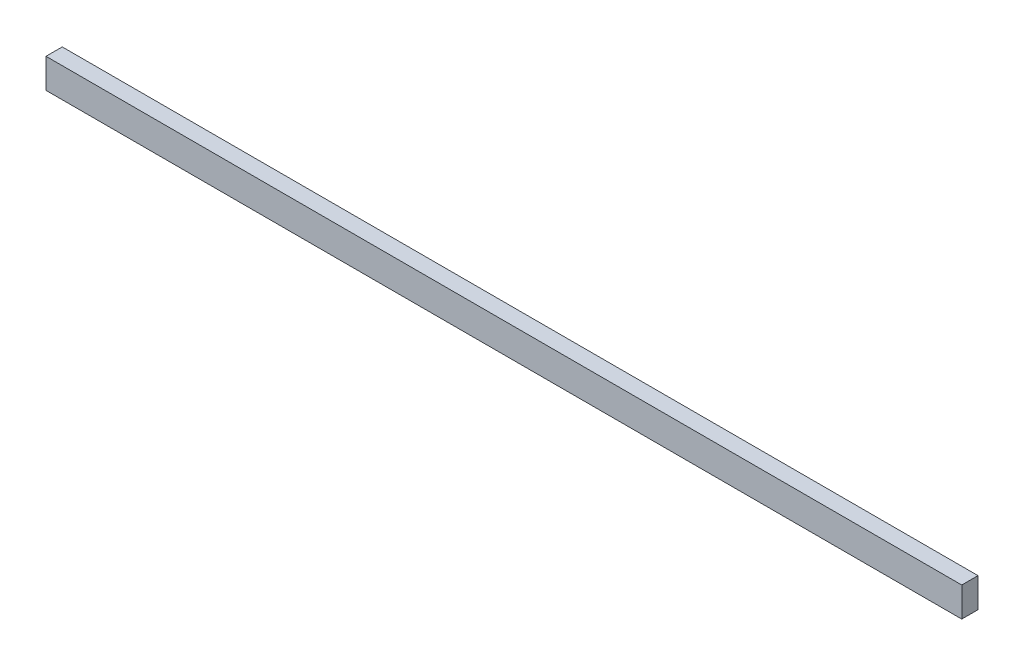
ISO-10303-21;
HEADER;
FILE_DESCRIPTION(('STEP AP214'),'2;1');
FILE_NAME('part.step','',(''),(''),'','','');
FILE_SCHEMA(('AUTOMOTIVE_DESIGN { 1 0 10303 214 1 1 1 1 }'));
ENDSEC;
DATA;
#1=APPLICATION_CONTEXT('core data for automotive mechanical design processes');
#2=APPLICATION_PROTOCOL_DEFINITION('international standard','automotive_design',2000,#1);
#3=PRODUCT_CONTEXT('',#1,'mechanical');
#4=PRODUCT('Part','Part','',(#3));
#5=PRODUCT_RELATED_PRODUCT_CATEGORY('part','',(#4));
#6=PRODUCT_DEFINITION_FORMATION('','',#4);
#7=PRODUCT_DEFINITION_CONTEXT('part definition',#1,'design');
#8=PRODUCT_DEFINITION('design','',#6,#7);
#9=PRODUCT_DEFINITION_SHAPE('','',#8);
#10=(LENGTH_UNIT() NAMED_UNIT(*) SI_UNIT(.MILLI.,.METRE.));
#11=(NAMED_UNIT(*) PLANE_ANGLE_UNIT() SI_UNIT($,.RADIAN.));
#12=(NAMED_UNIT(*) SI_UNIT($,.STERADIAN.) SOLID_ANGLE_UNIT());
#13=UNCERTAINTY_MEASURE_WITH_UNIT(LENGTH_MEASURE(1.E-05),#10,'distance_accuracy_value','');
#14=(GEOMETRIC_REPRESENTATION_CONTEXT(3) GLOBAL_UNCERTAINTY_ASSIGNED_CONTEXT((#13)) GLOBAL_UNIT_ASSIGNED_CONTEXT((#10,
#11,#12)) REPRESENTATION_CONTEXT('',''));
#15=CARTESIAN_POINT('',(0.,0.,0.));
#16=DIRECTION('',(0.,0.,1.));
#17=DIRECTION('',(1.,0.,0.));
#18=AXIS2_PLACEMENT_3D('',#15,#16,#17);
#19=CARTESIAN_POINT('',(0.,0.,5.5));
#20=DIRECTION('',(-1.,0.,0.));
#21=DIRECTION('',(0.,0.,1.));
#22=AXIS2_PLACEMENT_3D('',#19,#20,#21);
#23=PLANE('',#22);
#24=DIRECTION('',(0.,1.,0.));
#25=VECTOR('',#24,1.);
#26=CARTESIAN_POINT('',(0.,0.,0.));
#27=LINE('',#26,#25);
#28=CARTESIAN_POINT('',(0.,0.,0.));
#29=VERTEX_POINT('',#28);
#30=CARTESIAN_POINT('',(0.,10.,0.));
#31=VERTEX_POINT('',#30);
#32=EDGE_CURVE('E98',#29,#31,#27,.T.);
#33=ORIENTED_EDGE('',*,*,#32,.T.);
#34=DIRECTION('',(0.,0.,-1.));
#35=VECTOR('',#34,1.);
#36=CARTESIAN_POINT('',(0.,10.,5.5));
#37=LINE('',#36,#35);
#38=CARTESIAN_POINT('',(0.,10.,5.5));
#39=VERTEX_POINT('',#38);
#40=EDGE_CURVE('E11',#39,#31,#37,.T.);
#41=ORIENTED_EDGE('',*,*,#40,.F.);
#42=DIRECTION('',(0.,1.,0.));
#43=VECTOR('',#42,1.);
#44=CARTESIAN_POINT('',(0.,0.,5.5));
#45=LINE('',#44,#43);
#46=CARTESIAN_POINT('',(0.,0.,5.5));
#47=VERTEX_POINT('',#46);
#48=EDGE_CURVE('E86',#47,#39,#45,.T.);
#49=ORIENTED_EDGE('',*,*,#48,.F.);
#50=DIRECTION('',(0.,0.,-1.));
#51=VECTOR('',#50,1.);
#52=CARTESIAN_POINT('',(0.,0.,5.5));
#53=LINE('',#52,#51);
#54=EDGE_CURVE('E94',#47,#29,#53,.T.);
#55=ORIENTED_EDGE('',*,*,#54,.T.);
#56=EDGE_LOOP('',(#33,#41,#49,#55));
#57=FACE_BOUND('',#56,.T.);
#58=ADVANCED_FACE('F35',(#57),#23,.F.);
#59=CARTESIAN_POINT('',(0.,10.,5.5));
#60=DIRECTION('',(0.,-1.,0.));
#61=DIRECTION('',(1.,0.,0.));
#62=AXIS2_PLACEMENT_3D('',#59,#60,#61);
#63=PLANE('',#62);
#64=DIRECTION('',(-1.,0.,0.));
#65=VECTOR('',#64,1.);
#66=CARTESIAN_POINT('',(0.,10.,0.));
#67=LINE('',#66,#65);
#68=CARTESIAN_POINT('',(-310.,10.,0.));
#69=VERTEX_POINT('',#68);
#70=EDGE_CURVE('E90',#31,#69,#67,.T.);
#71=ORIENTED_EDGE('',*,*,#70,.T.);
#72=DIRECTION('',(0.,0.,-1.));
#73=VECTOR('',#72,1.);
#74=CARTESIAN_POINT('',(-310.,10.,5.5));
#75=LINE('',#74,#73);
#76=CARTESIAN_POINT('',(-310.,10.,5.5));
#77=VERTEX_POINT('',#76);
#78=EDGE_CURVE('E43',#77,#69,#75,.T.);
#79=ORIENTED_EDGE('',*,*,#78,.F.);
#80=DIRECTION('',(-1.,0.,0.));
#81=VECTOR('',#80,1.);
#82=CARTESIAN_POINT('',(0.,10.,5.5));
#83=LINE('',#82,#81);
#84=EDGE_CURVE('E81',#39,#77,#83,.T.);
#85=ORIENTED_EDGE('',*,*,#84,.F.);
#86=ORIENTED_EDGE('',*,*,#40,.T.);
#87=EDGE_LOOP('',(#71,#79,#85,#86));
#88=FACE_BOUND('',#87,.T.);
#89=ADVANCED_FACE('F89',(#88),#63,.F.);
#90=CARTESIAN_POINT('',(-310.,0.,5.5));
#91=DIRECTION('',(1.,0.,0.));
#92=DIRECTION('',(0.,0.,-1.));
#93=AXIS2_PLACEMENT_3D('',#90,#91,#92);
#94=PLANE('',#93);
#95=DIRECTION('',(0.,-1.,0.));
#96=VECTOR('',#95,1.);
#97=CARTESIAN_POINT('',(-310.,0.,0.));
#98=LINE('',#97,#96);
#99=CARTESIAN_POINT('',(-310.,0.,0.));
#100=VERTEX_POINT('',#99);
#101=EDGE_CURVE('E68',#69,#100,#98,.T.);
#102=ORIENTED_EDGE('',*,*,#101,.T.);
#103=DIRECTION('',(0.,0.,-1.));
#104=VECTOR('',#103,1.);
#105=CARTESIAN_POINT('',(-310.,0.,5.5));
#106=LINE('',#105,#104);
#107=CARTESIAN_POINT('',(-310.,0.,5.5));
#108=VERTEX_POINT('',#107);
#109=EDGE_CURVE('E91',#108,#100,#106,.T.);
#110=ORIENTED_EDGE('',*,*,#109,.F.);
#111=DIRECTION('',(0.,-1.,0.));
#112=VECTOR('',#111,1.);
#113=CARTESIAN_POINT('',(-310.,0.,5.5));
#114=LINE('',#113,#112);
#115=EDGE_CURVE('E84',#77,#108,#114,.T.);
#116=ORIENTED_EDGE('',*,*,#115,.F.);
#117=ORIENTED_EDGE('',*,*,#78,.T.);
#118=EDGE_LOOP('',(#102,#110,#116,#117));
#119=FACE_BOUND('',#118,.T.);
#120=ADVANCED_FACE('F92',(#119),#94,.F.);
#121=CARTESIAN_POINT('',(0.,0.,5.5));
#122=DIRECTION('',(0.,1.,0.));
#123=DIRECTION('',(-1.,0.,0.));
#124=AXIS2_PLACEMENT_3D('',#121,#122,#123);
#125=PLANE('',#124);
#126=DIRECTION('',(1.,0.,0.));
#127=VECTOR('',#126,1.);
#128=CARTESIAN_POINT('',(0.,0.,0.));
#129=LINE('',#128,#127);
#130=EDGE_CURVE('E74',#100,#29,#129,.T.);
#131=ORIENTED_EDGE('',*,*,#130,.T.);
#132=ORIENTED_EDGE('',*,*,#54,.F.);
#133=DIRECTION('',(1.,0.,0.));
#134=VECTOR('',#133,1.);
#135=CARTESIAN_POINT('',(0.,0.,5.5));
#136=LINE('',#135,#134);
#137=EDGE_CURVE('E51',#108,#47,#136,.T.);
#138=ORIENTED_EDGE('',*,*,#137,.F.);
#139=ORIENTED_EDGE('',*,*,#109,.T.);
#140=EDGE_LOOP('',(#131,#132,#138,#139));
#141=FACE_BOUND('',#140,.T.);
#142=ADVANCED_FACE('F105',(#141),#125,.F.);
#143=CARTESIAN_POINT('',(0.,0.,5.5));
#144=DIRECTION('',(0.,0.,1.));
#145=DIRECTION('',(1.,0.,0.));
#146=AXIS2_PLACEMENT_3D('',#143,#144,#145);
#147=PLANE('',#146);
#148=ORIENTED_EDGE('',*,*,#48,.T.);
#149=ORIENTED_EDGE('',*,*,#84,.T.);
#150=ORIENTED_EDGE('',*,*,#115,.T.);
#151=ORIENTED_EDGE('',*,*,#137,.T.);
#152=EDGE_LOOP('',(#148,#149,#150,#151));
#153=FACE_BOUND('',#152,.T.);
#154=ADVANCED_FACE('F82',(#153),#147,.T.);
#155=CARTESIAN_POINT('',(0.,0.,0.));
#156=DIRECTION('',(0.,0.,1.));
#157=DIRECTION('',(1.,0.,0.));
#158=AXIS2_PLACEMENT_3D('',#155,#156,#157);
#159=PLANE('',#158);
#160=ORIENTED_EDGE('',*,*,#32,.F.);
#161=ORIENTED_EDGE('',*,*,#130,.F.);
#162=ORIENTED_EDGE('',*,*,#101,.F.);
#163=ORIENTED_EDGE('',*,*,#70,.F.);
#164=EDGE_LOOP('',(#160,#161,#162,#163));
#165=FACE_BOUND('',#164,.T.);
#166=ADVANCED_FACE('F108',(#165),#159,.F.);
#167=CLOSED_SHELL('',(#58,#89,#120,#142,#154,#166));
#168=MANIFOLD_SOLID_BREP('B2',#167);
#169=ADVANCED_BREP_SHAPE_REPRESENTATION('',(#18,#168),#14);
#170=SHAPE_DEFINITION_REPRESENTATION(#9,#169);
ENDSEC;
END-ISO-10303-21;
